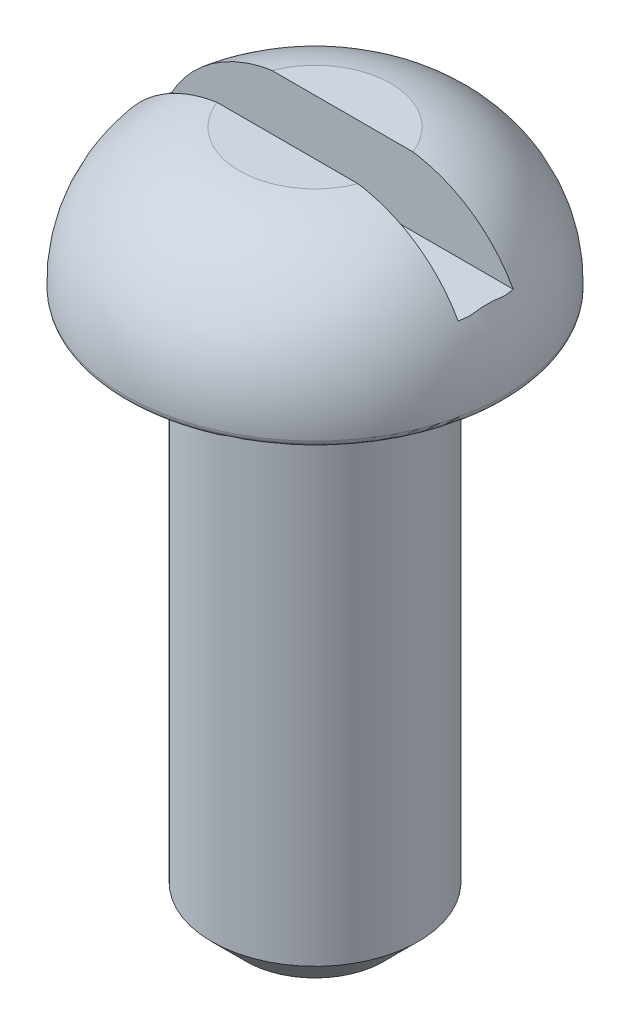
ISO-10303-21;
HEADER;
FILE_DESCRIPTION(('STEP AP214'),'2;1');
FILE_NAME('part.step','',(''),(''),'','','');
FILE_SCHEMA(('AUTOMOTIVE_DESIGN { 1 0 10303 214 1 1 1 1 }'));
ENDSEC;
DATA;
#1=APPLICATION_CONTEXT('core data for automotive mechanical design processes');
#2=APPLICATION_PROTOCOL_DEFINITION('international standard','automotive_design',2000,#1);
#3=PRODUCT_CONTEXT('',#1,'mechanical');
#4=PRODUCT('Part','Part','',(#3));
#5=PRODUCT_RELATED_PRODUCT_CATEGORY('part','',(#4));
#6=PRODUCT_DEFINITION_FORMATION('','',#4);
#7=PRODUCT_DEFINITION_CONTEXT('part definition',#1,'design');
#8=PRODUCT_DEFINITION('design','',#6,#7);
#9=PRODUCT_DEFINITION_SHAPE('','',#8);
#10=(LENGTH_UNIT() NAMED_UNIT(*) SI_UNIT(.MILLI.,.METRE.));
#11=(NAMED_UNIT(*) PLANE_ANGLE_UNIT() SI_UNIT($,.RADIAN.));
#12=(NAMED_UNIT(*) SI_UNIT($,.STERADIAN.) SOLID_ANGLE_UNIT());
#13=UNCERTAINTY_MEASURE_WITH_UNIT(LENGTH_MEASURE(1.E-05),#10,'distance_accuracy_value','');
#14=(GEOMETRIC_REPRESENTATION_CONTEXT(3) GLOBAL_UNCERTAINTY_ASSIGNED_CONTEXT((#13)) GLOBAL_UNIT_ASSIGNED_CONTEXT((#10,
#11,#12)) REPRESENTATION_CONTEXT('',''));
#15=CARTESIAN_POINT('',(0.,0.,0.));
#16=DIRECTION('',(0.,0.,1.));
#17=DIRECTION('',(1.,0.,0.));
#18=AXIS2_PLACEMENT_3D('',#15,#16,#17);
#19=CARTESIAN_POINT('',(0.,10.,0.));
#20=DIRECTION('',(0.,1.,0.));
#21=DIRECTION('',(0.,0.,1.));
#22=AXIS2_PLACEMENT_3D('',#19,#20,#21);
#23=PLANE('',#22);
#24=DIRECTION('',(-1.,0.,0.));
#25=VECTOR('',#24,1.);
#26=CARTESIAN_POINT('',(-2.5,10.,-0.4));
#27=LINE('',#26,#25);
#28=CARTESIAN_POINT('',(1.02469507659595,10.,-0.4));
#29=VERTEX_POINT('',#28);
#30=CARTESIAN_POINT('',(-1.02469507659595,10.,-0.4));
#31=VERTEX_POINT('',#30);
#32=EDGE_CURVE('E95',#29,#31,#27,.T.);
#33=ORIENTED_EDGE('',*,*,#32,.F.);
#34=CARTESIAN_POINT('',(0.,10.,0.));
#35=DIRECTION('',(0.,-1.,0.));
#36=DIRECTION('',(0.,0.,-1.));
#37=AXIS2_PLACEMENT_3D('',#34,#35,#36);
#38=CIRCLE('',#37,1.1);
#39=EDGE_CURVE('E101',#31,#29,#38,.T.);
#40=ORIENTED_EDGE('',*,*,#39,.F.);
#41=EDGE_LOOP('',(#33,#40));
#42=FACE_BOUND('',#41,.T.);
#43=ADVANCED_FACE('F29',(#42),#23,.T.);
#44=CARTESIAN_POINT('',(1.,0.,0.));
#45=DIRECTION('',(0.,-1.,0.));
#46=DIRECTION('',(0.,0.,-1.));
#47=AXIS2_PLACEMENT_3D('',#44,#45,#46);
#48=PLANE('',#47);
#49=CARTESIAN_POINT('',(0.,0.,0.));
#50=DIRECTION('',(0.,-1.,0.));
#51=DIRECTION('',(0.,0.,-1.));
#52=AXIS2_PLACEMENT_3D('',#49,#50,#51);
#53=CIRCLE('',#52,1.);
#54=CARTESIAN_POINT('',(0.,0.,-1.));
#55=VERTEX_POINT('',#54);
#56=EDGE_CURVE('E223',#55,#55,#53,.T.);
#57=ORIENTED_EDGE('',*,*,#56,.T.);
#58=EDGE_LOOP('',(#57));
#59=FACE_BOUND('',#58,.T.);
#60=ADVANCED_FACE('F31',(#59),#48,.T.);
#61=DIRECTION('',(1.,0.,0.));
#62=VECTOR('',#61,1.);
#63=CARTESIAN_POINT('',(-2.5,10.,0.4));
#64=LINE('',#63,#62);
#65=CARTESIAN_POINT('',(-1.02469507659595,10.,0.4));
#66=VERTEX_POINT('',#65);
#67=CARTESIAN_POINT('',(1.02469507659595,10.,0.4));
#68=VERTEX_POINT('',#67);
#69=EDGE_CURVE('E87',#66,#68,#64,.T.);
#70=ORIENTED_EDGE('',*,*,#69,.F.);
#71=EDGE_CURVE('E94',#68,#66,#38,.T.);
#72=ORIENTED_EDGE('',*,*,#71,.F.);
#73=EDGE_LOOP('',(#70,#72));
#74=FACE_BOUND('',#73,.T.);
#75=ADVANCED_FACE('F93',(#74),#23,.T.);
#76=CARTESIAN_POINT('',(0.,8.05009977634097,0.));
#77=DIRECTION('',(0.,-1.,0.));
#78=DIRECTION('',(0.,0.,-1.));
#79=AXIS2_PLACEMENT_3D('',#76,#77,#78);
#80=DEGENERATE_TOROIDAL_SURFACE('',#79,0.779672442615777,1.97603659537097,.T.);
#81=CARTESIAN_POINT('',(0.,9.98931855269485,0.4));
#82=CARTESIAN_POINT('',(0.0336322301279484,9.98932057160009,0.4));
#83=CARTESIAN_POINT('',(0.0672648143564294,9.99017844682174,0.4));
#84=CARTESIAN_POINT('',(0.134486048973815,9.99327874083744,0.4));
#85=CARTESIAN_POINT('',(0.168074638300507,9.99552232790957,0.4));
#86=CARTESIAN_POINT('',(0.235341692539278,10.000675588183,0.4));
#87=CARTESIAN_POINT('',(0.269019918116884,10.0035880994358,0.4));
#88=CARTESIAN_POINT('',(0.336378018840054,10.0093648088338,0.4));
#89=CARTESIAN_POINT('',(0.370057893639487,10.0122290108159,0.4));
#90=CARTESIAN_POINT('',(0.437877287244912,10.0174111816535,0.4));
#91=CARTESIAN_POINT('',(0.472017389468459,10.0197220409397,0.4));
#92=CARTESIAN_POINT('',(0.540348220697959,10.0233824621022,0.4));
#93=CARTESIAN_POINT('',(0.57453894786776,10.024732058027,0.4));
#94=CARTESIAN_POINT('',(0.677147719963299,10.0269491128557,0.4));
#95=CARTESIAN_POINT('',(0.745623445649575,10.0259868039846,0.4));
#96=CARTESIAN_POINT('',(0.881972396232886,10.0181001103437,0.4));
#97=CARTESIAN_POINT('',(0.949846939653068,10.0112000935624,0.4));
#98=CARTESIAN_POINT('',(1.08464932382839,9.99105274779902,0.4));
#99=CARTESIAN_POINT('',(1.1515770535867,9.97780468086785,0.4));
#100=CARTESIAN_POINT('',(1.32743905883569,9.93389987134993,0.4));
#101=CARTESIAN_POINT('',(1.43501246700903,9.89752417313684,0.4));
#102=CARTESIAN_POINT('',(1.64277375092832,9.80714096430149,0.4));
#103=CARTESIAN_POINT('',(1.74294278143891,9.7530902425877,0.4));
#104=CARTESIAN_POINT('',(1.93265776354999,9.6286817859467,0.4));
#105=CARTESIAN_POINT('',(2.02220009208707,9.55831851343564,0.4));
#106=CARTESIAN_POINT('',(2.18779655682164,9.40332750087542,0.4));
#107=CARTESIAN_POINT('',(2.26386325268286,9.31871318823932,0.4));
#108=CARTESIAN_POINT('',(2.39887936251544,9.1395132914902,0.4));
#109=CARTESIAN_POINT('',(2.4581485407167,9.04516847216826,0.4));
#110=CARTESIAN_POINT('',(2.55988756159558,8.84778550701506,0.4));
#111=CARTESIAN_POINT('',(2.60235359515437,8.7447453964566,0.4));
#112=CARTESIAN_POINT('',(2.66896720325158,8.53374228552121,0.4));
#113=CARTESIAN_POINT('',(2.69324730817994,8.4258211017661,0.4));
#114=CARTESIAN_POINT('',(2.72329499940504,8.20744823782145,0.4));
#115=CARTESIAN_POINT('',(2.72906565960174,8.09699698087495,0.4));
#116=CARTESIAN_POINT('',(2.72194370625239,7.87696236883575,0.4));
#117=CARTESIAN_POINT('',(2.70909546504866,7.76737757402578,0.4));
#118=CARTESIAN_POINT('',(2.66518054080641,7.55188571140622,0.4));
#119=CARTESIAN_POINT('',(2.63410816106256,7.44597980455423,0.4));
#120=CARTESIAN_POINT('',(2.55461964830542,7.2408306457122,0.4));
#121=CARTESIAN_POINT('',(2.50619477197843,7.14159078249458,0.4));
#122=CARTESIAN_POINT('',(2.39346155608861,6.95273088408203,0.4));
#123=CARTESIAN_POINT('',(2.32917055267638,6.86310050138865,0.4));
#124=CARTESIAN_POINT('',(2.18644835327305,6.6957164743583,0.4));
#125=CARTESIAN_POINT('',(2.10799740164992,6.61797970730241,0.4));
#126=CARTESIAN_POINT('',(1.93891521729074,6.47637070602941,0.4));
#127=CARTESIAN_POINT('',(1.848242283131,6.41254798893161,0.4));
#128=CARTESIAN_POINT('',(1.70483704950054,6.32845353975037,0.4));
#129=CARTESIAN_POINT('',(1.65548996211767,6.30224282235779,0.4));
#130=CARTESIAN_POINT('',(1.55478898942817,6.25401999092747,0.4));
#131=CARTESIAN_POINT('',(1.50343572310356,6.23200659399397,0.4));
#132=CARTESIAN_POINT('',(1.39961052954736,6.19248489891929,0.4));
#133=CARTESIAN_POINT('',(1.347154703557,6.17493417047835,0.4));
#134=CARTESIAN_POINT('',(1.24096668900781,6.14408744215701,0.4));
#135=CARTESIAN_POINT('',(1.18723349557358,6.13079491967621,0.4));
#136=CARTESIAN_POINT('',(1.06403178522895,6.10540925143502,0.4));
#137=CARTESIAN_POINT('',(0.994285023188468,6.09464216463719,0.4));
#138=CARTESIAN_POINT('',(0.88922111766015,6.08346831458644,0.4));
#139=CARTESIAN_POINT('',(0.854144078017138,6.08057337378565,0.4));
#140=CARTESIAN_POINT('',(0.783890511350772,6.07635427432128,0.4));
#141=CARTESIAN_POINT('',(0.748713977069512,6.07503023337693,0.4));
#142=CARTESIAN_POINT('',(0.67763895923875,6.07382766649052,0.4));
#143=CARTESIAN_POINT('',(0.641740038461024,6.07397842909008,0.4));
#144=CARTESIAN_POINT('',(0.569980696305413,6.07560637957031,0.4));
#145=CARTESIAN_POINT('',(0.5341202696723,6.07708335451461,0.4));
#146=CARTESIAN_POINT('',(0.462484408653194,6.08107184682247,0.4));
#147=CARTESIAN_POINT('',(0.426708933647413,6.08358267671921,0.4));
#148=CARTESIAN_POINT('',(0.355202454218474,6.08919106283036,0.4));
#149=CARTESIAN_POINT('',(0.319471456309091,6.09228869666957,0.4));
#150=CARTESIAN_POINT('',(0.242092989679416,6.09891537046344,0.4));
#151=CARTESIAN_POINT('',(0.200444216725497,6.10243104449402,0.4));
#152=CARTESIAN_POINT('',(0.117048492487853,6.10793876047995,0.4));
#153=CARTESIAN_POINT('',(0.0753016013203501,6.10993157004804,0.4));
#154=CARTESIAN_POINT('',(-0.00826329739638326,6.11128251065855,0.4));
#155=CARTESIAN_POINT('',(-0.0500813291633601,6.11063940172566,0.4));
#156=CARTESIAN_POINT('',(-0.133639653626791,6.10710338129503,0.4));
#157=CARTESIAN_POINT('',(-0.175379845783712,6.10420849425575,0.4));
#158=CARTESIAN_POINT('',(-0.258750304049264,6.09759434000434,0.4));
#159=CARTESIAN_POINT('',(-0.300380631753041,6.09387574128072,0.4));
#160=CARTESIAN_POINT('',(-0.383666399543678,6.08687617469605,0.4));
#161=CARTESIAN_POINT('',(-0.425321824593193,6.08359504505871,0.4));
#162=CARTESIAN_POINT('',(-0.508683231706567,6.07829633581178,0.4));
#163=CARTESIAN_POINT('',(-0.55038913486036,6.07627762499527,0.4));
#164=CARTESIAN_POINT('',(-0.633847536707204,6.07399446673123,0.4));
#165=CARTESIAN_POINT('',(-0.675600033238118,6.07372994101215,0.4));
#166=CARTESIAN_POINT('',(-0.798279554043512,6.07599985703048,0.4));
#167=CARTESIAN_POINT('',(-0.879185473529187,6.08139508938235,0.4));
#168=CARTESIAN_POINT('',(-1.04009545442691,6.10108936309313,0.4));
#169=CARTESIAN_POINT('',(-1.12009731292897,6.11540673598556,0.4));
#170=CARTESIAN_POINT('',(-1.27744036603234,6.15313717677758,0.4));
#171=CARTESIAN_POINT('',(-1.35479443169429,6.17649630804984,0.4));
#172=CARTESIAN_POINT('',(-1.50607354050175,6.2322003727284,0.4));
#173=CARTESIAN_POINT('',(-1.5800040682891,6.26453030927326,0.4));
#174=CARTESIAN_POINT('',(-1.70066637437019,6.32620164457037,0.4));
#175=CARTESIAN_POINT('',(-1.74858977096688,6.35324055633356,0.4));
#176=CARTESIAN_POINT('',(-1.84204738578038,6.41119705677249,0.4));
#177=CARTESIAN_POINT('',(-1.88758126390444,6.44211519545458,0.4));
#178=CARTESIAN_POINT('',(-1.97648927226605,6.50805504558627,0.4));
#179=CARTESIAN_POINT('',(-2.01982815044718,6.54312436341343,0.4));
#180=CARTESIAN_POINT('',(-2.10337243061363,6.61678085845384,0.4));
#181=CARTESIAN_POINT('',(-2.14357835593785,6.655367445784,0.4));
#182=CARTESIAN_POINT('',(-2.25876075366804,6.7757272034825,0.4));
#183=CARTESIAN_POINT('',(-2.32872619866147,6.8624156004796,0.4));
#184=CARTESIAN_POINT('',(-2.45273016359907,7.04594486934809,0.4));
#185=CARTESIAN_POINT('',(-2.50683160667454,7.14274350788805,0.4));
#186=CARTESIAN_POINT('',(-2.5978963937645,7.34393303608955,0.4));
#187=CARTESIAN_POINT('',(-2.63488542916092,7.44831227036985,0.4));
#188=CARTESIAN_POINT('',(-2.69078481684572,7.66192713634903,0.4));
#189=CARTESIAN_POINT('',(-2.70967494073831,7.77116805944681,0.4));
#190=CARTESIAN_POINT('',(-2.72872049994938,7.99083950597836,0.4));
#191=CARTESIAN_POINT('',(-2.72894896278393,8.10126370098521,0.4));
#192=CARTESIAN_POINT('',(-2.71085046679964,8.32054549822337,0.4));
#193=CARTESIAN_POINT('',(-2.69252940318256,8.42940358702924,0.4));
#194=CARTESIAN_POINT('',(-2.6378866049697,8.64243700752171,0.4));
#195=CARTESIAN_POINT('',(-2.60157509032429,8.74661496127788,0.4));
#196=CARTESIAN_POINT('',(-2.51199794489188,8.94742525876716,0.4));
#197=CARTESIAN_POINT('',(-2.4587296513187,9.04405641442848,0.4));
#198=CARTESIAN_POINT('',(-2.33667666099482,9.22719648017851,0.4));
#199=CARTESIAN_POINT('',(-2.26786608902611,9.31368814076627,0.4));
#200=CARTESIAN_POINT('',(-2.11678830197833,9.47393638064336,0.4));
#201=CARTESIAN_POINT('',(-2.03452512343719,9.54769676642613,0.4));
#202=CARTESIAN_POINT('',(-1.85845680132228,9.68087682539435,0.4));
#203=CARTESIAN_POINT('',(-1.76459390280117,9.74021998734933,0.4));
#204=CARTESIAN_POINT('',(-1.56825068819723,9.84262599868146,0.4));
#205=CARTESIAN_POINT('',(-1.46576450258915,9.8856776476967,0.4));
#206=CARTESIAN_POINT('',(-1.30705768686085,9.93767741598373,0.4));
#207=CARTESIAN_POINT('',(-1.25283407094745,9.9529905421259,0.4));
#208=CARTESIAN_POINT('',(-1.14331010617465,9.97919836316371,0.4));
#209=CARTESIAN_POINT('',(-1.08800961915714,9.99009248715327,0.4));
#210=CARTESIAN_POINT('',(-0.976811740038316,10.0075176170994,0.4));
#211=CARTESIAN_POINT('',(-0.920915266039601,10.0140545600937,0.4));
#212=CARTESIAN_POINT('',(-0.808825447819268,10.0230046821046,0.4));
#213=CARTESIAN_POINT('',(-0.752632245417653,10.0254196787798,0.4));
#214=CARTESIAN_POINT('',(-0.638202420490304,10.0265954454027,0.4));
#215=CARTESIAN_POINT('',(-0.579964874932424,10.0252218904068,0.4));
#216=CARTESIAN_POINT('',(-0.46360277126239,10.0194855430093,0.4));
#217=CARTESIAN_POINT('',(-0.405478390226039,10.015119687082,0.4));
#218=CARTESIAN_POINT('',(-0.318466264025561,10.0078602606046,0.4));
#219=CARTESIAN_POINT('',(-0.289542668712635,10.0053271525568,0.4));
#220=CARTESIAN_POINT('',(-0.231677824652642,10.0004358120315,0.4));
#221=CARTESIAN_POINT('',(-0.202736575195299,9.998077587132,0.4));
#222=CARTESIAN_POINT('',(-0.144850436771997,9.99400846001751,0.4));
#223=CARTESIAN_POINT('',(-0.115905623626884,9.99229655568349,0.4));
#224=CARTESIAN_POINT('',(-0.0579739548392673,9.98995084154621,0.4));
#225=CARTESIAN_POINT('',(-0.0289871089406201,9.98931681263105,0.4));
#226=CARTESIAN_POINT('',(0.,9.98931855269485,0.4));
#227=B_SPLINE_CURVE_WITH_KNOTS('',3,(#81,#82,#83,#84,#85,#86,#87,#88,#89,#90,#91,#92,#93,#94,
#95,#96,#97,#98,#99,#100,#101,#102,#103,#104,#105,#106,#107,#108,#109,#110,#111,#112,#113,#114,
#115,#116,#117,#118,#119,#120,#121,#122,#123,#124,#125,#126,#127,#128,#129,#130,#131,#132,#133,
#134,#135,#136,#137,#138,#139,#140,#141,#142,#143,#144,#145,#146,#147,#148,#149,#150,#151,#152,
#153,#154,#155,#156,#157,#158,#159,#160,#161,#162,#163,#164,#165,#166,#167,#168,#169,#170,#171,
#172,#173,#174,#175,#176,#177,#178,#179,#180,#181,#182,#183,#184,#185,#186,#187,#188,#189,#190,
#191,#192,#193,#194,#195,#196,#197,#198,#199,#200,#201,#202,#203,#204,#205,#206,#207,#208,#209,
#210,#211,#212,#213,#214,#215,#216,#217,#218,#219,#220,#221,#222,#223,#224,#225,#226),
.UNSPECIFIED.,.T.,.F.,(4,2,2,2,2,2,2,2,2,2,2,2,2,2,2,2,2,2,2,2,2,2,2,2,2,2,2,2,2,2,2,2,2,2,2,2,
2,2,2,2,2,2,2,2,2,2,2,2,2,2,2,2,2,2,2,2,2,2,2,2,2,2,2,2,2,2,2,2,2,2,2,2,4),(0.,
0.100890023684147,0.20186522294138,0.303277014523181,0.404680713008293,0.507324699032977,
0.60996504917535,0.815182329830902,1.01956140617602,1.22396424697931,1.56297001300182,
1.9028108396941,2.24276720072985,2.58240502666488,2.91506020623248,3.24779075253565,
3.57807227226821,3.90829893865739,4.23773990589671,4.56728390841,4.89699419059368,
5.22634579707032,5.55616050998683,5.88713046661353,6.05459853805703,6.22201534115169,
6.38777523813919,6.55367015739326,6.76501012148146,6.87057116918615,6.97614012686717,
7.08380979826552,7.19146218533486,7.29904310373739,7.40663826332749,7.53202567740017,
7.65734984711895,7.78273297795787,7.90822623480996,8.03361801752365,8.1589633009104,
8.28419610546769,8.40942332211286,8.65221314412578,8.89550345712298,9.13736430175846,
9.37882322878399,9.54372519059966,9.70865055909821,9.87569425907157,10.0427099954235,
10.3751757055228,10.7063043070526,11.0369341487598,11.3679330920178,11.6976366954212,
12.0272355490161,12.3566473796013,12.6861109644933,13.0161271461231,13.346044485437,
13.6776761947942,14.0095354874336,14.178415684656,14.3473176931479,14.5159890849235,
14.6845860782746,14.8592368371135,15.0340666714876,15.1211717845946,15.2082806699839,
15.2952539330296,15.3822095139242),.UNSPECIFIED.);
#228=CARTESIAN_POINT('',(-2.48037267208639,9.,0.4));
#229=VERTEX_POINT('',#228);
#230=EDGE_CURVE('E11',#229,#66,#227,.T.);
#231=ORIENTED_EDGE('',*,*,#230,.F.);
#232=CARTESIAN_POINT('',(0.,9.,0.));
#233=DIRECTION('',(0.,1.,0.));
#234=DIRECTION('',(0.,0.,1.));
#235=AXIS2_PLACEMENT_3D('',#232,#233,#234);
#236=CIRCLE('',#235,2.51241887280624);
#237=CARTESIAN_POINT('',(-2.5,9.,0.249496678200315));
#238=VERTEX_POINT('',#237);
#239=EDGE_CURVE('E42',#229,#238,#236,.F.);
#240=ORIENTED_EDGE('',*,*,#239,.T.);
#241=CARTESIAN_POINT('',(-2.5,9.02231051560983,0.));
#242=CARTESIAN_POINT('',(-2.5,9.02231014613126,0.0712306788425637));
#243=CARTESIAN_POINT('',(-2.5,9.0169240888941,0.142558865114006));
#244=CARTESIAN_POINT('',(-2.5,8.99524833344988,0.283701712225145));
#245=CARTESIAN_POINT('',(-2.5,8.97893018759636,0.353511932388625));
#246=CARTESIAN_POINT('',(-2.5,8.93503448743745,0.489880588433878));
#247=CARTESIAN_POINT('',(-2.5,8.90741010654933,0.556424195769019));
#248=CARTESIAN_POINT('',(-2.5,8.8407369512236,0.683471035223091));
#249=CARTESIAN_POINT('',(-2.5,8.80171066461155,0.743985845778093));
#250=CARTESIAN_POINT('',(-2.5,8.72273078631452,0.84327576057503));
#251=CARTESIAN_POINT('',(-2.5,8.68504077468055,0.883854319520759));
#252=CARTESIAN_POINT('',(-2.5,8.60345396988963,0.958249349802387));
#253=CARTESIAN_POINT('',(-2.5,8.55955954334449,0.992068387670542));
#254=CARTESIAN_POINT('',(-2.5,8.46614541066804,1.0515647045904));
#255=CARTESIAN_POINT('',(-2.5,8.41659333803926,1.07719158850154));
#256=CARTESIAN_POINT('',(-2.5,8.31351364402817,1.11857305743128));
#257=CARTESIAN_POINT('',(-2.5,8.25998836215314,1.13433340129616));
#258=CARTESIAN_POINT('',(-2.5,8.15684471263328,1.15387563353978));
#259=CARTESIAN_POINT('',(-2.5,8.10743646195622,1.15877596536218));
#260=CARTESIAN_POINT('',(-2.5,8.0085452840721,1.15971101314126));
#261=CARTESIAN_POINT('',(-2.5,7.95906239205352,1.15574907177318));
#262=CARTESIAN_POINT('',(-2.5,7.86411851550255,1.13961207805657));
#263=CARTESIAN_POINT('',(-2.5,7.81858208628392,1.12787399445516));
#264=CARTESIAN_POINT('',(-2.5,7.73002594829076,1.09717394472953));
#265=CARTESIAN_POINT('',(-2.5,7.68700637658874,1.07821158558015));
#266=CARTESIAN_POINT('',(-2.5,7.60297401465296,1.03306389528727));
#267=CARTESIAN_POINT('',(-2.5,7.56208688516074,1.00664580851613));
#268=CARTESIAN_POINT('',(-2.5,7.48478671975293,0.947939477777545));
#269=CARTESIAN_POINT('',(-2.5,7.44837523694311,0.915649205671531));
#270=CARTESIAN_POINT('',(-2.5,7.37688415061919,0.842566073313489));
#271=CARTESIAN_POINT('',(-2.5,7.34235687266142,0.801234383081304));
#272=CARTESIAN_POINT('',(-2.5,7.27963990234519,0.714029036243398));
#273=CARTESIAN_POINT('',(-2.5,7.25145347759936,0.668153055300625));
#274=CARTESIAN_POINT('',(-2.5,7.19762640831854,0.565705611586473));
#275=CARTESIAN_POINT('',(-2.5,7.17304925893739,0.508575952252565));
#276=CARTESIAN_POINT('',(-2.5,7.13232205749344,0.39139734128899));
#277=CARTESIAN_POINT('',(-2.5,7.11617692086438,0.331346709126053));
#278=CARTESIAN_POINT('',(-2.5,7.09021129797167,0.199724484838883));
#279=CARTESIAN_POINT('',(-2.5,7.08184217840078,0.127864571020891));
#280=CARTESIAN_POINT('',(-2.5,7.07613814300471,-0.0163393775210896));
#281=CARTESIAN_POINT('',(-2.5,7.07881401975148,-0.0886838167684077));
#282=CARTESIAN_POINT('',(-2.5,7.09604186513655,-0.238852141273033));
#283=CARTESIAN_POINT('',(-2.5,7.11168190921542,-0.316555155132484));
#284=CARTESIAN_POINT('',(-2.5,7.15654537923408,-0.467928327990437));
#285=CARTESIAN_POINT('',(-2.5,7.18575221829127,-0.541603289127112));
#286=CARTESIAN_POINT('',(-2.5,7.24966259731633,-0.665743650160987));
#287=CARTESIAN_POINT('',(-2.5,7.28156459660841,-0.717654202163195));
#288=CARTESIAN_POINT('',(-2.5,7.35347835023177,-0.815560730450134));
#289=CARTESIAN_POINT('',(-2.5,7.39348640053243,-0.861559392517833));
#290=CARTESIAN_POINT('',(-2.5,7.48148468689641,-0.946000066696019));
#291=CARTESIAN_POINT('',(-2.5,7.52953463612758,-0.984380466316215));
#292=CARTESIAN_POINT('',(-2.5,7.6322573046179,-1.05096309856745));
#293=CARTESIAN_POINT('',(-2.5,7.68692394977712,-1.07917457297966));
#294=CARTESIAN_POINT('',(-2.5,7.79307039548012,-1.12047369115394));
#295=CARTESIAN_POINT('',(-2.5,7.84394870147081,-1.1351112921511));
#296=CARTESIAN_POINT('',(-2.5,7.94753962820184,-1.15459744549458));
#297=CARTESIAN_POINT('',(-2.5,8.00025091501122,-1.15945297101361));
#298=CARTESIAN_POINT('',(-2.5,8.1004596648121,-1.15911656356735));
#299=CARTESIAN_POINT('',(-2.5,8.14796294964309,-1.1548606781451));
#300=CARTESIAN_POINT('',(-2.5,8.24155559060142,-1.13837987259776));
#301=CARTESIAN_POINT('',(-2.5,8.28764514563643,-1.12615607896913));
#302=CARTESIAN_POINT('',(-2.5,8.37694763368273,-1.09439743039534));
#303=CARTESIAN_POINT('',(-2.5,8.42017402232899,-1.07490012929803));
#304=CARTESIAN_POINT('',(-2.5,8.50305034194318,-1.02941245372522));
#305=CARTESIAN_POINT('',(-2.5,8.54269937916833,-1.00342046273776));
#306=CARTESIAN_POINT('',(-2.5,8.62055136516311,-0.943733525554368));
#307=CARTESIAN_POINT('',(-2.5,8.6584219937318,-0.909606632222676));
#308=CARTESIAN_POINT('',(-2.5,8.72871751030709,-0.836166720546385));
#309=CARTESIAN_POINT('',(-2.5,8.76114062595824,-0.796852021741524));
#310=CARTESIAN_POINT('',(-2.5,8.82428707291293,-0.708603935542909));
#311=CARTESIAN_POINT('',(-2.5,8.85419467708597,-0.659088099147602));
#312=CARTESIAN_POINT('',(-2.5,8.90664449994323,-0.556273142143712));
#313=CARTESIAN_POINT('',(-2.5,8.92917840946965,-0.502969835297222));
#314=CARTESIAN_POINT('',(-2.5,8.9700907472227,-0.384754626029006));
#315=CARTESIAN_POINT('',(-2.5,8.98715155139994,-0.319388131208311));
#316=CARTESIAN_POINT('',(-2.5,9.01150494008411,-0.186964805934883));
#317=CARTESIAN_POINT('',(-2.5,9.01881409678225,-0.119911041019673));
#318=CARTESIAN_POINT('',(-2.5,9.02198216855268,-0.0351795517586193));
#319=CARTESIAN_POINT('',(-2.5,9.02231060686467,-0.0175927498795496));
#320=CARTESIAN_POINT('',(-2.5,9.02231051560983,0.));
#321=B_SPLINE_CURVE_WITH_KNOTS('',3,(#241,#242,#243,#244,#245,#246,#247,#248,#249,#250,#251,
#252,#253,#254,#255,#256,#257,#258,#259,#260,#261,#262,#263,#264,#265,#266,#267,#268,#269,#270,
#271,#272,#273,#274,#275,#276,#277,#278,#279,#280,#281,#282,#283,#284,#285,#286,#287,#288,#289,
#290,#291,#292,#293,#294,#295,#296,#297,#298,#299,#300,#301,#302,#303,#304,#305,#306,#307,#308,
#309,#310,#311,#312,#313,#314,#315,#316,#317,#318,#319,#320),.UNSPECIFIED.,.T.,.F.,(4,2,2,2,2,2,
2,2,2,2,2,2,2,2,2,2,2,2,2,2,2,2,2,2,2,2,2,2,2,2,2,2,2,2,2,2,2,2,2,4),(0.,0.213654058428577,
0.427866261467033,0.642974783844956,0.857661882047725,1.02313256849239,1.18854030728179,
1.35494682143161,1.52125611759126,1.6694369131548,1.81756182725976,1.95799843379395,
2.09844268164834,2.24387837543208,2.38936439560361,2.55030448513531,2.71132732241044,
2.89719032712376,3.08316155989775,3.29930936619596,3.51566843039356,3.7522771145924,
3.98859727727576,4.17066050848426,4.35264073342776,4.53603759006511,4.71926734814893,
4.87720820490713,5.03503643330442,5.17743169042945,5.31980682019252,5.46145680385799,
5.60314207902792,5.75546979409161,5.90784697360662,6.08072712684902,6.25380142712086,
6.45570811901972,6.65727124675774,6.71004011646053),.UNSPECIFIED.);
#322=CARTESIAN_POINT('',(-2.5,9.,-0.249496678200315));
#323=VERTEX_POINT('',#322);
#324=EDGE_CURVE('E33',#323,#238,#321,.T.);
#325=ORIENTED_EDGE('',*,*,#324,.F.);
#326=CARTESIAN_POINT('',(-2.48037267208639,9.,-0.4));
#327=VERTEX_POINT('',#326);
#328=EDGE_CURVE('E202',#323,#327,#236,.F.);
#329=ORIENTED_EDGE('',*,*,#328,.T.);
#330=CARTESIAN_POINT('',(0.,9.98931855269485,-0.4));
#331=CARTESIAN_POINT('',(-0.0336322301279489,9.98932057160009,-0.4));
#332=CARTESIAN_POINT('',(-0.06726481435643,9.99017844682174,-0.4));
#333=CARTESIAN_POINT('',(-0.134486048973815,9.99327874083744,-0.4));
#334=CARTESIAN_POINT('',(-0.168074638300508,9.99552232790957,-0.4));
#335=CARTESIAN_POINT('',(-0.235341692539279,10.000675588183,-0.4));
#336=CARTESIAN_POINT('',(-0.269019918116885,10.0035880994358,-0.4));
#337=CARTESIAN_POINT('',(-0.336378018840054,10.0093648088338,-0.4));
#338=CARTESIAN_POINT('',(-0.370057893639488,10.0122290108159,-0.4));
#339=CARTESIAN_POINT('',(-0.437877287244913,10.0174111816535,-0.4));
#340=CARTESIAN_POINT('',(-0.47201738946846,10.0197220409397,-0.4));
#341=CARTESIAN_POINT('',(-0.54034822069796,10.0233824621022,-0.4));
#342=CARTESIAN_POINT('',(-0.574538947867761,10.024732058027,-0.4));
#343=CARTESIAN_POINT('',(-0.6771477199633,10.0269491128557,-0.4));
#344=CARTESIAN_POINT('',(-0.745623445649576,10.0259868039846,-0.4));
#345=CARTESIAN_POINT('',(-0.881972396232887,10.0181001103437,-0.4));
#346=CARTESIAN_POINT('',(-0.94984693965307,10.0112000935624,-0.4));
#347=CARTESIAN_POINT('',(-1.08464932382839,9.99105274779902,-0.4));
#348=CARTESIAN_POINT('',(-1.1515770535867,9.97780468086785,-0.4));
#349=CARTESIAN_POINT('',(-1.3274390588357,9.93389987134993,-0.4));
#350=CARTESIAN_POINT('',(-1.43501246700903,9.89752417313684,-0.4));
#351=CARTESIAN_POINT('',(-1.64277375092832,9.80714096430149,-0.4));
#352=CARTESIAN_POINT('',(-1.74294278143891,9.75309024258769,-0.4));
#353=CARTESIAN_POINT('',(-1.93265776354999,9.62868178594669,-0.4));
#354=CARTESIAN_POINT('',(-2.02220009208707,9.55831851343564,-0.4));
#355=CARTESIAN_POINT('',(-2.18779655682164,9.40332750087542,-0.4));
#356=CARTESIAN_POINT('',(-2.26386325268286,9.31871318823932,-0.4));
#357=CARTESIAN_POINT('',(-2.39887936251544,9.1395132914902,-0.4));
#358=CARTESIAN_POINT('',(-2.4581485407167,9.04516847216825,-0.4));
#359=CARTESIAN_POINT('',(-2.55988756159558,8.84778550701506,-0.4));
#360=CARTESIAN_POINT('',(-2.60235359515437,8.7447453964566,-0.4));
#361=CARTESIAN_POINT('',(-2.66896720325158,8.53374228552121,-0.4));
#362=CARTESIAN_POINT('',(-2.69324730817994,8.4258211017661,-0.4));
#363=CARTESIAN_POINT('',(-2.72329499940504,8.20744823782144,-0.4));
#364=CARTESIAN_POINT('',(-2.72906565960174,8.09699698087495,-0.4));
#365=CARTESIAN_POINT('',(-2.72194370625239,7.87696236883574,-0.4));
#366=CARTESIAN_POINT('',(-2.70909546504866,7.76737757402578,-0.4));
#367=CARTESIAN_POINT('',(-2.66518054080641,7.55188571140622,-0.4));
#368=CARTESIAN_POINT('',(-2.63410816106256,7.44597980455422,-0.4));
#369=CARTESIAN_POINT('',(-2.55461964830541,7.2408306457122,-0.4));
#370=CARTESIAN_POINT('',(-2.50619477197843,7.14159078249458,-0.4));
#371=CARTESIAN_POINT('',(-2.39346155608861,6.95273088408203,-0.4));
#372=CARTESIAN_POINT('',(-2.32917055267637,6.86310050138865,-0.4));
#373=CARTESIAN_POINT('',(-2.18644835327305,6.6957164743583,-0.4));
#374=CARTESIAN_POINT('',(-2.10799740164992,6.61797970730241,-0.4));
#375=CARTESIAN_POINT('',(-1.93891521729074,6.47637070602941,-0.4));
#376=CARTESIAN_POINT('',(-1.848242283131,6.41254798893161,-0.4));
#377=CARTESIAN_POINT('',(-1.70483704950054,6.32845353975037,-0.4));
#378=CARTESIAN_POINT('',(-1.65548996211767,6.30224282235779,-0.4));
#379=CARTESIAN_POINT('',(-1.55478898942816,6.25401999092746,-0.4));
#380=CARTESIAN_POINT('',(-1.50343572310356,6.23200659399397,-0.4));
#381=CARTESIAN_POINT('',(-1.39961052954736,6.19248489891929,-0.4));
#382=CARTESIAN_POINT('',(-1.347154703557,6.17493417047835,-0.4));
#383=CARTESIAN_POINT('',(-1.24096668900781,6.14408744215701,-0.4));
#384=CARTESIAN_POINT('',(-1.18723349557358,6.13079491967621,-0.4));
#385=CARTESIAN_POINT('',(-1.06403178522895,6.10540925143502,-0.4));
#386=CARTESIAN_POINT('',(-0.994285023188466,6.09464216463719,-0.4));
#387=CARTESIAN_POINT('',(-0.889221117660147,6.08346831458644,-0.4));
#388=CARTESIAN_POINT('',(-0.854144078017135,6.08057337378565,-0.4));
#389=CARTESIAN_POINT('',(-0.783890511350769,6.07635427432128,-0.4));
#390=CARTESIAN_POINT('',(-0.748713977069509,6.07503023337693,-0.4));
#391=CARTESIAN_POINT('',(-0.677638959238747,6.07382766649052,-0.4));
#392=CARTESIAN_POINT('',(-0.641740038461021,6.07397842909008,-0.4));
#393=CARTESIAN_POINT('',(-0.569980696305409,6.07560637957031,-0.4));
#394=CARTESIAN_POINT('',(-0.534120269672296,6.07708335451461,-0.4));
#395=CARTESIAN_POINT('',(-0.46248440865319,6.08107184682247,-0.4));
#396=CARTESIAN_POINT('',(-0.426708933647408,6.08358267671921,-0.4));
#397=CARTESIAN_POINT('',(-0.35520245421847,6.08919106283036,-0.4));
#398=CARTESIAN_POINT('',(-0.319471456309087,6.09228869666957,-0.4));
#399=CARTESIAN_POINT('',(-0.242092989679411,6.09891537046344,-0.4));
#400=CARTESIAN_POINT('',(-0.200444216725492,6.10243104449402,-0.4));
#401=CARTESIAN_POINT('',(-0.117048492487848,6.10793876047995,-0.4));
#402=CARTESIAN_POINT('',(-0.0753016013203446,6.10993157004804,-0.4));
#403=CARTESIAN_POINT('',(0.0082632973963892,6.11128251065855,-0.4));
#404=CARTESIAN_POINT('',(0.0500813291633662,6.11063940172566,-0.4));
#405=CARTESIAN_POINT('',(0.133639653626798,6.10710338129503,-0.4));
#406=CARTESIAN_POINT('',(0.175379845783719,6.10420849425575,-0.4));
#407=CARTESIAN_POINT('',(0.258750304049271,6.09759434000434,-0.4));
#408=CARTESIAN_POINT('',(0.300380631753048,6.09387574128072,-0.4));
#409=CARTESIAN_POINT('',(0.383666399543686,6.08687617469605,-0.4));
#410=CARTESIAN_POINT('',(0.425321824593201,6.08359504505871,-0.4));
#411=CARTESIAN_POINT('',(0.508683231706575,6.07829633581178,-0.4));
#412=CARTESIAN_POINT('',(0.550389134860368,6.07627762499527,-0.4));
#413=CARTESIAN_POINT('',(0.633847536707214,6.07399446673123,-0.4));
#414=CARTESIAN_POINT('',(0.675600033238129,6.07372994101215,-0.4));
#415=CARTESIAN_POINT('',(0.798279554043523,6.07599985703048,-0.4));
#416=CARTESIAN_POINT('',(0.879185473529199,6.08139508938235,-0.4));
#417=CARTESIAN_POINT('',(1.04009545442693,6.10108936309313,-0.4));
#418=CARTESIAN_POINT('',(1.12009731292898,6.11540673598556,-0.4));
#419=CARTESIAN_POINT('',(1.27744036603235,6.15313717677758,-0.4));
#420=CARTESIAN_POINT('',(1.3547944316943,6.17649630804985,-0.4));
#421=CARTESIAN_POINT('',(1.50607354050177,6.23220037272841,-0.4));
#422=CARTESIAN_POINT('',(1.58000406828911,6.26453030927326,-0.4));
#423=CARTESIAN_POINT('',(1.70066637437021,6.32620164457038,-0.4));
#424=CARTESIAN_POINT('',(1.74858977096689,6.35324055633357,-0.4));
#425=CARTESIAN_POINT('',(1.84204738578039,6.4111970567725,-0.4));
#426=CARTESIAN_POINT('',(1.88758126390445,6.44211519545459,-0.400000000000001));
#427=CARTESIAN_POINT('',(1.97648927226607,6.50805504558628,-0.400000000000001));
#428=CARTESIAN_POINT('',(2.01982815044719,6.54312436341344,-0.400000000000001));
#429=CARTESIAN_POINT('',(2.10337243061364,6.61678085845385,-0.400000000000001));
#430=CARTESIAN_POINT('',(2.14357835593786,6.65536744578402,-0.400000000000001));
#431=CARTESIAN_POINT('',(2.25876075366805,6.77572720348251,-0.400000000000001));
#432=CARTESIAN_POINT('',(2.32872619866148,6.86241560047961,-0.400000000000001));
#433=CARTESIAN_POINT('',(2.45273016359908,7.0459448693481,-0.400000000000001));
#434=CARTESIAN_POINT('',(2.50683160667455,7.14274350788807,-0.400000000000001));
#435=CARTESIAN_POINT('',(2.5978963937645,7.34393303608957,-0.400000000000001));
#436=CARTESIAN_POINT('',(2.63488542916093,7.44831227036986,-0.400000000000001));
#437=CARTESIAN_POINT('',(2.69078481684573,7.66192713634904,-0.400000000000001));
#438=CARTESIAN_POINT('',(2.70967494073831,7.77116805944683,-0.400000000000001));
#439=CARTESIAN_POINT('',(2.72872049994938,7.99083950597838,-0.400000000000001));
#440=CARTESIAN_POINT('',(2.72894896278393,8.10126370098522,-0.400000000000001));
#441=CARTESIAN_POINT('',(2.71085046679964,8.32054549822339,-0.400000000000001));
#442=CARTESIAN_POINT('',(2.69252940318256,8.42940358702925,-0.400000000000001));
#443=CARTESIAN_POINT('',(2.63788660496969,8.64243700752173,-0.400000000000001));
#444=CARTESIAN_POINT('',(2.60157509032428,8.74661496127789,-0.400000000000001));
#445=CARTESIAN_POINT('',(2.51199794489188,8.94742525876718,-0.400000000000001));
#446=CARTESIAN_POINT('',(2.45872965131869,9.0440564144285,-0.400000000000001));
#447=CARTESIAN_POINT('',(2.33667666099481,9.22719648017852,-0.400000000000001));
#448=CARTESIAN_POINT('',(2.2678660890261,9.31368814076628,-0.400000000000001));
#449=CARTESIAN_POINT('',(2.11678830197832,9.47393638064337,-0.400000000000001));
#450=CARTESIAN_POINT('',(2.03452512343718,9.54769676642614,-0.400000000000001));
#451=CARTESIAN_POINT('',(1.85845680132227,9.68087682539436,-0.400000000000001));
#452=CARTESIAN_POINT('',(1.76459390280115,9.74021998734933,-0.4));
#453=CARTESIAN_POINT('',(1.56825068819721,9.84262599868147,-0.4));
#454=CARTESIAN_POINT('',(1.46576450258914,9.88567764769671,-0.4));
#455=CARTESIAN_POINT('',(1.30705768686084,9.93767741598373,-0.4));
#456=CARTESIAN_POINT('',(1.25283407094744,9.9529905421259,-0.4));
#457=CARTESIAN_POINT('',(1.14331010617463,9.97919836316371,-0.4));
#458=CARTESIAN_POINT('',(1.08800961915713,9.99009248715327,-0.4));
#459=CARTESIAN_POINT('',(0.9768117400383,10.0075176170994,-0.4));
#460=CARTESIAN_POINT('',(0.920915266039585,10.0140545600937,-0.4));
#461=CARTESIAN_POINT('',(0.808825447819252,10.0230046821046,-0.4));
#462=CARTESIAN_POINT('',(0.752632245417636,10.0254196787798,-0.4));
#463=CARTESIAN_POINT('',(0.638202420490288,10.0265954454027,-0.4));
#464=CARTESIAN_POINT('',(0.57996487493241,10.0252218904068,-0.4));
#465=CARTESIAN_POINT('',(0.463602771262379,10.0194855430093,-0.4));
#466=CARTESIAN_POINT('',(0.40547839022603,10.015119687082,-0.4));
#467=CARTESIAN_POINT('',(0.318466264025555,10.0078602606046,-0.4));
#468=CARTESIAN_POINT('',(0.289542668712629,10.0053271525568,-0.4));
#469=CARTESIAN_POINT('',(0.231677824652637,10.0004358120315,-0.4));
#470=CARTESIAN_POINT('',(0.202736575195295,9.998077587132,-0.4));
#471=CARTESIAN_POINT('',(0.144850436771994,9.99400846001751,-0.4));
#472=CARTESIAN_POINT('',(0.115905623626881,9.99229655568349,-0.4));
#473=CARTESIAN_POINT('',(0.0579739548392657,9.98995084154621,-0.4));
#474=CARTESIAN_POINT('',(0.0289871089406191,9.98931681263105,-0.4));
#475=CARTESIAN_POINT('',(0.,9.98931855269485,-0.4));
#476=B_SPLINE_CURVE_WITH_KNOTS('',3,(#330,#331,#332,#333,#334,#335,#336,#337,#338,#339,#340,
#341,#342,#343,#344,#345,#346,#347,#348,#349,#350,#351,#352,#353,#354,#355,#356,#357,#358,#359,
#360,#361,#362,#363,#364,#365,#366,#367,#368,#369,#370,#371,#372,#373,#374,#375,#376,#377,#378,
#379,#380,#381,#382,#383,#384,#385,#386,#387,#388,#389,#390,#391,#392,#393,#394,#395,#396,#397,
#398,#399,#400,#401,#402,#403,#404,#405,#406,#407,#408,#409,#410,#411,#412,#413,#414,#415,#416,
#417,#418,#419,#420,#421,#422,#423,#424,#425,#426,#427,#428,#429,#430,#431,#432,#433,#434,#435,
#436,#437,#438,#439,#440,#441,#442,#443,#444,#445,#446,#447,#448,#449,#450,#451,#452,#453,#454,
#455,#456,#457,#458,#459,#460,#461,#462,#463,#464,#465,#466,#467,#468,#469,#470,#471,#472,#473,
#474,#475),.UNSPECIFIED.,.T.,.F.,(4,2,2,2,2,2,2,2,2,2,2,2,2,2,2,2,2,2,2,2,2,2,2,2,2,2,2,2,2,2,2,
2,2,2,2,2,2,2,2,2,2,2,2,2,2,2,2,2,2,2,2,2,2,2,2,2,2,2,2,2,2,2,2,2,2,2,2,2,2,2,2,2,4),(0.,
0.100890023684148,0.201865222941381,0.303277014523182,0.404680713008294,0.507324699032977,
0.609965049175351,0.815182329830903,1.01956140617603,1.22396424697931,1.56297001300182,
1.9028108396941,2.24276720072985,2.58240502666488,2.91506020623248,3.24779075253565,
3.57807227226821,3.90829893865739,4.23773990589672,4.56728390841,4.89699419059368,
5.22634579707032,5.55616050998683,5.88713046661354,6.05459853805703,6.22201534115169,
6.38777523813919,6.55367015739326,6.76501012148146,6.87057116918615,6.97614012686717,
7.08380979826552,7.19146218533486,7.29904310373739,7.40663826332749,7.53202567740017,
7.65734984711895,7.78273297795787,7.90822623480997,8.03361801752366,8.1589633009104,
8.2841961054677,8.40942332211287,8.65221314412579,8.89550345712299,9.13736430175847,
9.378823228784,9.54372519059967,9.70865055909822,9.87569425907158,10.0427099954235,
10.3751757055228,10.7063043070527,11.0369341487598,11.3679330920179,11.6976366954212,
12.0272355490161,12.3566473796013,12.6861109644933,13.0161271461231,13.346044485437,
13.6776761947943,14.0095354874336,14.178415684656,14.3473176931479,14.5159890849235,
14.6845860782746,14.8592368371135,15.0340666714876,15.1211717845946,15.2082806699839,
15.2952539330296,15.3822095139241),.UNSPECIFIED.);
#477=EDGE_CURVE('E203',#31,#327,#476,.T.);
#478=ORIENTED_EDGE('',*,*,#477,.F.);
#479=ORIENTED_EDGE('',*,*,#39,.T.);
#480=CARTESIAN_POINT('',(2.48037267208639,9.,-0.400000000000001));
#481=VERTEX_POINT('',#480);
#482=EDGE_CURVE('E199',#481,#29,#476,.T.);
#483=ORIENTED_EDGE('',*,*,#482,.F.);
#484=CARTESIAN_POINT('',(2.5,9.,-0.249496678200321));
#485=VERTEX_POINT('',#484);
#486=EDGE_CURVE('E114',#481,#485,#236,.F.);
#487=ORIENTED_EDGE('',*,*,#486,.T.);
#488=CARTESIAN_POINT('',(2.5,9.02231051560984,0.));
#489=CARTESIAN_POINT('',(2.5,9.02231014613126,-0.0712306788425643));
#490=CARTESIAN_POINT('',(2.5,9.01692408889411,-0.142558865114007));
#491=CARTESIAN_POINT('',(2.5,8.99524833344988,-0.283701712225146));
#492=CARTESIAN_POINT('',(2.5,8.97893018759636,-0.353511932388626));
#493=CARTESIAN_POINT('',(2.5,8.93503448743745,-0.489880588433879));
#494=CARTESIAN_POINT('',(2.5,8.90741010654933,-0.55642419576902));
#495=CARTESIAN_POINT('',(2.5,8.8407369512236,-0.683471035223092));
#496=CARTESIAN_POINT('',(2.5,8.80171066461155,-0.743985845778094));
#497=CARTESIAN_POINT('',(2.5,8.72273078631452,-0.843275760575032));
#498=CARTESIAN_POINT('',(2.5,8.68504077468055,-0.883854319520761));
#499=CARTESIAN_POINT('',(2.5,8.60345396988963,-0.958249349802389));
#500=CARTESIAN_POINT('',(2.5,8.55955954334449,-0.992068387670542));
#501=CARTESIAN_POINT('',(2.5,8.46614541066804,-1.0515647045904));
#502=CARTESIAN_POINT('',(2.5,8.41659333803926,-1.07719158850154));
#503=CARTESIAN_POINT('',(2.5,8.31351364402817,-1.11857305743129));
#504=CARTESIAN_POINT('',(2.5,8.25998836215314,-1.13433340129616));
#505=CARTESIAN_POINT('',(2.5,8.15684471263328,-1.15387563353978));
#506=CARTESIAN_POINT('',(2.5,8.10743646195621,-1.15877596536218));
#507=CARTESIAN_POINT('',(2.5,8.0085452840721,-1.15971101314126));
#508=CARTESIAN_POINT('',(2.5,7.95906239205352,-1.15574907177318));
#509=CARTESIAN_POINT('',(2.5,7.86411851550255,-1.13961207805657));
#510=CARTESIAN_POINT('',(2.5,7.81858208628392,-1.12787399445517));
#511=CARTESIAN_POINT('',(2.5,7.73002594829075,-1.09717394472954));
#512=CARTESIAN_POINT('',(2.5,7.68700637658874,-1.07821158558015));
#513=CARTESIAN_POINT('',(2.5,7.60297401465296,-1.03306389528727));
#514=CARTESIAN_POINT('',(2.5,7.56208688516074,-1.00664580851613));
#515=CARTESIAN_POINT('',(2.5,7.48478671975293,-0.947939477777548));
#516=CARTESIAN_POINT('',(2.5,7.44837523694311,-0.915649205671534));
#517=CARTESIAN_POINT('',(2.5,7.37688415061919,-0.842566073313491));
#518=CARTESIAN_POINT('',(2.5,7.34235687266142,-0.801234383081306));
#519=CARTESIAN_POINT('',(2.5,7.27963990234519,-0.714029036243399));
#520=CARTESIAN_POINT('',(2.5,7.25145347759936,-0.668153055300625));
#521=CARTESIAN_POINT('',(2.5,7.19762640831854,-0.565705611586473));
#522=CARTESIAN_POINT('',(2.5,7.17304925893739,-0.508575952252566));
#523=CARTESIAN_POINT('',(2.5,7.13232205749344,-0.391397341288991));
#524=CARTESIAN_POINT('',(2.5,7.11617692086437,-0.331346709126053));
#525=CARTESIAN_POINT('',(2.5,7.09021129797167,-0.199724484838882));
#526=CARTESIAN_POINT('',(2.5,7.08184217840077,-0.127864571020891));
#527=CARTESIAN_POINT('',(2.5,7.07613814300471,0.0163393775210896));
#528=CARTESIAN_POINT('',(2.5,7.07881401975147,0.0886838167684079));
#529=CARTESIAN_POINT('',(2.5,7.09604186513655,0.238852141273033));
#530=CARTESIAN_POINT('',(2.5,7.11168190921542,0.316555155132484));
#531=CARTESIAN_POINT('',(2.5,7.15654537923407,0.467928327990438));
#532=CARTESIAN_POINT('',(2.5,7.18575221829127,0.541603289127113));
#533=CARTESIAN_POINT('',(2.5,7.24966259731633,0.665743650160987));
#534=CARTESIAN_POINT('',(2.5,7.28156459660841,0.717654202163194));
#535=CARTESIAN_POINT('',(2.5,7.35347835023177,0.815560730450134));
#536=CARTESIAN_POINT('',(2.5,7.39348640053243,0.861559392517833));
#537=CARTESIAN_POINT('',(2.5,7.48148468689641,0.946000066696018));
#538=CARTESIAN_POINT('',(2.5,7.52953463612758,0.984380466316213));
#539=CARTESIAN_POINT('',(2.5,7.6322573046179,1.05096309856745));
#540=CARTESIAN_POINT('',(2.5,7.68692394977712,1.07917457297966));
#541=CARTESIAN_POINT('',(2.5,7.79307039548012,1.12047369115394));
#542=CARTESIAN_POINT('',(2.5,7.84394870147081,1.1351112921511));
#543=CARTESIAN_POINT('',(2.5,7.94753962820184,1.15459744549458));
#544=CARTESIAN_POINT('',(2.5,8.00025091501122,1.15945297101361));
#545=CARTESIAN_POINT('',(2.5,8.1004596648121,1.15911656356735));
#546=CARTESIAN_POINT('',(2.5,8.14796294964309,1.1548606781451));
#547=CARTESIAN_POINT('',(2.5,8.24155559060142,1.13837987259776));
#548=CARTESIAN_POINT('',(2.5,8.28764514563643,1.12615607896913));
#549=CARTESIAN_POINT('',(2.5,8.37694763368273,1.09439743039534));
#550=CARTESIAN_POINT('',(2.5,8.42017402232899,1.07490012929803));
#551=CARTESIAN_POINT('',(2.5,8.50305034194318,1.02941245372523));
#552=CARTESIAN_POINT('',(2.5,8.54269937916833,1.00342046273776));
#553=CARTESIAN_POINT('',(2.5,8.62055136516311,0.943733525554368));
#554=CARTESIAN_POINT('',(2.5,8.6584219937318,0.909606632222676));
#555=CARTESIAN_POINT('',(2.5,8.72871751030709,0.836166720546385));
#556=CARTESIAN_POINT('',(2.5,8.76114062595824,0.796852021741523));
#557=CARTESIAN_POINT('',(2.5,8.82428707291293,0.708603935542908));
#558=CARTESIAN_POINT('',(2.5,8.85419467708597,0.659088099147601));
#559=CARTESIAN_POINT('',(2.5,8.90664449994323,0.556273142143712));
#560=CARTESIAN_POINT('',(2.5,8.92917840946965,0.502969835297221));
#561=CARTESIAN_POINT('',(2.5,8.9700907472227,0.384754626029005));
#562=CARTESIAN_POINT('',(2.5,8.98715155139995,0.31938813120831));
#563=CARTESIAN_POINT('',(2.5,9.01150494008411,0.186964805934882));
#564=CARTESIAN_POINT('',(2.5,9.01881409678225,0.11991104101967));
#565=CARTESIAN_POINT('',(2.5,9.02198216855268,0.0351795517586176));
#566=CARTESIAN_POINT('',(2.5,9.02231060686468,0.0175927498795484));
#567=CARTESIAN_POINT('',(2.5,9.02231051560984,0.));
#568=B_SPLINE_CURVE_WITH_KNOTS('',3,(#488,#489,#490,#491,#492,#493,#494,#495,#496,#497,#498,
#499,#500,#501,#502,#503,#504,#505,#506,#507,#508,#509,#510,#511,#512,#513,#514,#515,#516,#517,
#518,#519,#520,#521,#522,#523,#524,#525,#526,#527,#528,#529,#530,#531,#532,#533,#534,#535,#536,
#537,#538,#539,#540,#541,#542,#543,#544,#545,#546,#547,#548,#549,#550,#551,#552,#553,#554,#555,
#556,#557,#558,#559,#560,#561,#562,#563,#564,#565,#566,#567),.UNSPECIFIED.,.T.,.F.,(4,2,2,2,2,2,
2,2,2,2,2,2,2,2,2,2,2,2,2,2,2,2,2,2,2,2,2,2,2,2,2,2,2,2,2,2,2,2,2,4),(0.,0.213654058428577,
0.427866261467033,0.642974783844956,0.857661882047726,1.02313256849239,1.18854030728179,
1.35494682143161,1.52125611759127,1.66943691315481,1.81756182725976,1.95799843379395,
2.09844268164834,2.24387837543209,2.38936439560362,2.55030448513531,2.71132732241044,
2.89719032712377,3.08316155989776,3.29930936619596,3.51566843039357,3.75227711459241,
3.98859727727577,4.17066050848427,4.35264073342777,4.53603759006512,4.71926734814894,
4.87720820490713,5.03503643330442,5.17743169042946,5.31980682019253,5.461456803858,
5.60314207902792,5.75546979409162,5.90784697360663,6.08072712684903,6.25380142712087,
6.45570811901973,6.65727124675775,6.71004011646054),.UNSPECIFIED.);
#569=CARTESIAN_POINT('',(2.5,9.,0.249496678200319));
#570=VERTEX_POINT('',#569);
#571=EDGE_CURVE('E119',#570,#485,#568,.T.);
#572=ORIENTED_EDGE('',*,*,#571,.F.);
#573=CARTESIAN_POINT('',(2.48037267208639,9.,0.4));
#574=VERTEX_POINT('',#573);
#575=EDGE_CURVE('E113',#570,#574,#236,.F.);
#576=ORIENTED_EDGE('',*,*,#575,.T.);
#577=EDGE_CURVE('E44',#68,#574,#227,.T.);
#578=ORIENTED_EDGE('',*,*,#577,.F.);
#579=ORIENTED_EDGE('',*,*,#71,.T.);
#580=EDGE_LOOP('',(#231,#240,#325,#329,#478,#479,#483,#487,#572,#576,#578,#579));
#581=FACE_BOUND('',#580,.T.);
#582=CARTESIAN_POINT('',(0.,7.99732948832317,0.));
#583=DIRECTION('',(0.,1.,0.));
#584=DIRECTION('',(0.,0.,1.));
#585=AXIS2_PLACEMENT_3D('',#582,#583,#584);
#586=CIRCLE('',#585,2.75500429396324);
#587=CARTESIAN_POINT('',(0.,7.99732948832317,2.75500429396324));
#588=VERTEX_POINT('',#587);
#589=EDGE_CURVE('E104',#588,#588,#586,.T.);
#590=ORIENTED_EDGE('',*,*,#589,.T.);
#591=EDGE_LOOP('',(#590));
#592=FACE_BOUND('',#591,.T.);
#593=ADVANCED_FACE('F97',(#581,#592),#80,.T.);
#594=CARTESIAN_POINT('',(2.75,7.9,0.));
#595=DIRECTION('',(0.,-1.,0.));
#596=DIRECTION('',(0.,0.,-1.));
#597=AXIS2_PLACEMENT_3D('',#594,#595,#596);
#598=PLANE('',#597);
#599=CARTESIAN_POINT('',(0.,7.9,0.));
#600=DIRECTION('',(0.,-1.,0.));
#601=DIRECTION('',(0.,0.,-1.));
#602=AXIS2_PLACEMENT_3D('',#599,#600,#601);
#603=CIRCLE('',#602,2.65503995848611);
#604=CARTESIAN_POINT('',(0.,7.9,-2.65503995848611));
#605=VERTEX_POINT('',#604);
#606=EDGE_CURVE('E100',#605,#605,#603,.T.);
#607=ORIENTED_EDGE('',*,*,#606,.T.);
#608=EDGE_LOOP('',(#607));
#609=FACE_BOUND('',#608,.T.);
#610=CARTESIAN_POINT('',(0.,7.9,0.));
#611=DIRECTION('',(0.,-1.,0.));
#612=DIRECTION('',(0.,0.,-1.));
#613=AXIS2_PLACEMENT_3D('',#610,#611,#612);
#614=CIRCLE('',#613,1.5);
#615=CARTESIAN_POINT('',(0.,7.9,-1.5));
#616=VERTEX_POINT('',#615);
#617=EDGE_CURVE('E107',#616,#616,#614,.T.);
#618=ORIENTED_EDGE('',*,*,#617,.F.);
#619=EDGE_LOOP('',(#618));
#620=FACE_BOUND('',#619,.T.);
#621=ADVANCED_FACE('F147',(#609,#620),#598,.T.);
#622=CARTESIAN_POINT('',(0.,0.,0.));
#623=DIRECTION('',(0.,-1.,0.));
#624=DIRECTION('',(0.,0.,-1.));
#625=AXIS2_PLACEMENT_3D('',#622,#623,#624);
#626=CYLINDRICAL_SURFACE('',#625,1.5);
#627=ORIENTED_EDGE('',*,*,#617,.T.);
#628=EDGE_LOOP('',(#627));
#629=FACE_BOUND('',#628,.T.);
#630=CARTESIAN_POINT('',(0.,0.500000000000002,0.));
#631=DIRECTION('',(0.,-1.,0.));
#632=DIRECTION('',(0.,0.,-1.));
#633=AXIS2_PLACEMENT_3D('',#630,#631,#632);
#634=CIRCLE('',#633,1.5);
#635=CARTESIAN_POINT('',(0.,0.500000000000002,-1.5));
#636=VERTEX_POINT('',#635);
#637=EDGE_CURVE('E225',#636,#636,#634,.T.);
#638=ORIENTED_EDGE('',*,*,#637,.F.);
#639=EDGE_LOOP('',(#638));
#640=FACE_BOUND('',#639,.T.);
#641=ADVANCED_FACE('F144',(#629,#640),#626,.T.);
#642=CARTESIAN_POINT('',(0.,0.,0.));
#643=DIRECTION('',(0.,1.,0.));
#644=DIRECTION('',(0.,0.,1.));
#645=AXIS2_PLACEMENT_3D('',#642,#643,#644);
#646=CONICAL_SURFACE('',#645,1.,0.785398163397446);
#647=ORIENTED_EDGE('',*,*,#637,.T.);
#648=EDGE_LOOP('',(#647));
#649=FACE_BOUND('',#648,.T.);
#650=ORIENTED_EDGE('',*,*,#56,.F.);
#651=EDGE_LOOP('',(#650));
#652=FACE_BOUND('',#651,.T.);
#653=ADVANCED_FACE('F140',(#649,#652),#646,.T.);
#654=CARTESIAN_POINT('',(0.,8.,0.));
#655=DIRECTION('',(0.,-1.,0.));
#656=DIRECTION('',(0.,0.,-1.));
#657=AXIS2_PLACEMENT_3D('',#654,#655,#656);
#658=TOROIDAL_SURFACE('',#657,2.65503995848611,0.1);
#659=ORIENTED_EDGE('',*,*,#589,.F.);
#660=EDGE_LOOP('',(#659));
#661=FACE_BOUND('',#660,.T.);
#662=ORIENTED_EDGE('',*,*,#606,.F.);
#663=EDGE_LOOP('',(#662));
#664=FACE_BOUND('',#663,.T.);
#665=ADVANCED_FACE('F136',(#661,#664),#658,.T.);
#666=CARTESIAN_POINT('',(-2.5,9.,-0.4));
#667=DIRECTION('',(-1.,0.,0.));
#668=DIRECTION('',(0.,0.,1.));
#669=AXIS2_PLACEMENT_3D('',#666,#667,#668);
#670=PLANE('',#669);
#671=ORIENTED_EDGE('',*,*,#324,.T.);
#672=DIRECTION('',(0.,0.,1.));
#673=VECTOR('',#672,1.);
#674=CARTESIAN_POINT('',(-2.5,9.,-0.4));
#675=LINE('',#674,#673);
#676=EDGE_CURVE('E213',#323,#238,#675,.T.);
#677=ORIENTED_EDGE('',*,*,#676,.F.);
#678=EDGE_LOOP('',(#671,#677));
#679=FACE_BOUND('',#678,.T.);
#680=ADVANCED_FACE('F131',(#679),#670,.F.);
#681=CARTESIAN_POINT('',(-2.5,9.,-0.4));
#682=DIRECTION('',(0.,0.,-1.));
#683=DIRECTION('',(-1.,0.,0.));
#684=AXIS2_PLACEMENT_3D('',#681,#682,#683);
#685=PLANE('',#684);
#686=ORIENTED_EDGE('',*,*,#477,.T.);
#687=DIRECTION('',(-1.,0.,0.));
#688=VECTOR('',#687,1.);
#689=CARTESIAN_POINT('',(-2.5,9.,-0.4));
#690=LINE('',#689,#688);
#691=EDGE_CURVE('E214',#481,#327,#690,.T.);
#692=ORIENTED_EDGE('',*,*,#691,.F.);
#693=ORIENTED_EDGE('',*,*,#482,.T.);
#694=ORIENTED_EDGE('',*,*,#32,.T.);
#695=EDGE_LOOP('',(#686,#692,#693,#694));
#696=FACE_BOUND('',#695,.T.);
#697=ADVANCED_FACE('F135',(#696),#685,.F.);
#698=CARTESIAN_POINT('',(2.5,9.,-0.400000000000001));
#699=DIRECTION('',(1.,0.,0.));
#700=DIRECTION('',(0.,0.,-1.));
#701=AXIS2_PLACEMENT_3D('',#698,#699,#700);
#702=PLANE('',#701);
#703=ORIENTED_EDGE('',*,*,#571,.T.);
#704=DIRECTION('',(0.,0.,-1.));
#705=VECTOR('',#704,1.);
#706=CARTESIAN_POINT('',(2.5,9.,-0.400000000000001));
#707=LINE('',#706,#705);
#708=EDGE_CURVE('E216',#570,#485,#707,.T.);
#709=ORIENTED_EDGE('',*,*,#708,.F.);
#710=EDGE_LOOP('',(#703,#709));
#711=FACE_BOUND('',#710,.T.);
#712=ADVANCED_FACE('F128',(#711),#702,.F.);
#713=CARTESIAN_POINT('',(-2.5,9.,0.4));
#714=DIRECTION('',(0.,0.,1.));
#715=DIRECTION('',(1.,0.,0.));
#716=AXIS2_PLACEMENT_3D('',#713,#714,#715);
#717=PLANE('',#716);
#718=ORIENTED_EDGE('',*,*,#577,.T.);
#719=DIRECTION('',(1.,0.,0.));
#720=VECTOR('',#719,1.);
#721=CARTESIAN_POINT('',(-2.5,9.,0.4));
#722=LINE('',#721,#720);
#723=EDGE_CURVE('E51',#229,#574,#722,.T.);
#724=ORIENTED_EDGE('',*,*,#723,.F.);
#725=ORIENTED_EDGE('',*,*,#230,.T.);
#726=ORIENTED_EDGE('',*,*,#69,.T.);
#727=EDGE_LOOP('',(#718,#724,#725,#726));
#728=FACE_BOUND('',#727,.T.);
#729=ADVANCED_FACE('F86',(#728),#717,.F.);
#730=CARTESIAN_POINT('',(-2.5,9.,-0.4));
#731=DIRECTION('',(0.,1.,0.));
#732=DIRECTION('',(0.,0.,1.));
#733=AXIS2_PLACEMENT_3D('',#730,#731,#732);
#734=PLANE('',#733);
#735=ORIENTED_EDGE('',*,*,#723,.T.);
#736=ORIENTED_EDGE('',*,*,#575,.F.);
#737=ORIENTED_EDGE('',*,*,#708,.T.);
#738=ORIENTED_EDGE('',*,*,#486,.F.);
#739=ORIENTED_EDGE('',*,*,#691,.T.);
#740=ORIENTED_EDGE('',*,*,#328,.F.);
#741=ORIENTED_EDGE('',*,*,#676,.T.);
#742=ORIENTED_EDGE('',*,*,#239,.F.);
#743=EDGE_LOOP('',(#735,#736,#737,#738,#739,#740,#741,#742));
#744=FACE_BOUND('',#743,.T.);
#745=ADVANCED_FACE('F127',(#744),#734,.T.);
#746=CLOSED_SHELL('',(#43,#60,#75,#593,#621,#641,#653,#665,#680,#697,#712,#729,#745));
#747=MANIFOLD_SOLID_BREP('B2',#746);
#748=ADVANCED_BREP_SHAPE_REPRESENTATION('',(#18,#747),#14);
#749=SHAPE_DEFINITION_REPRESENTATION(#9,#748);
ENDSEC;
END-ISO-10303-21;
